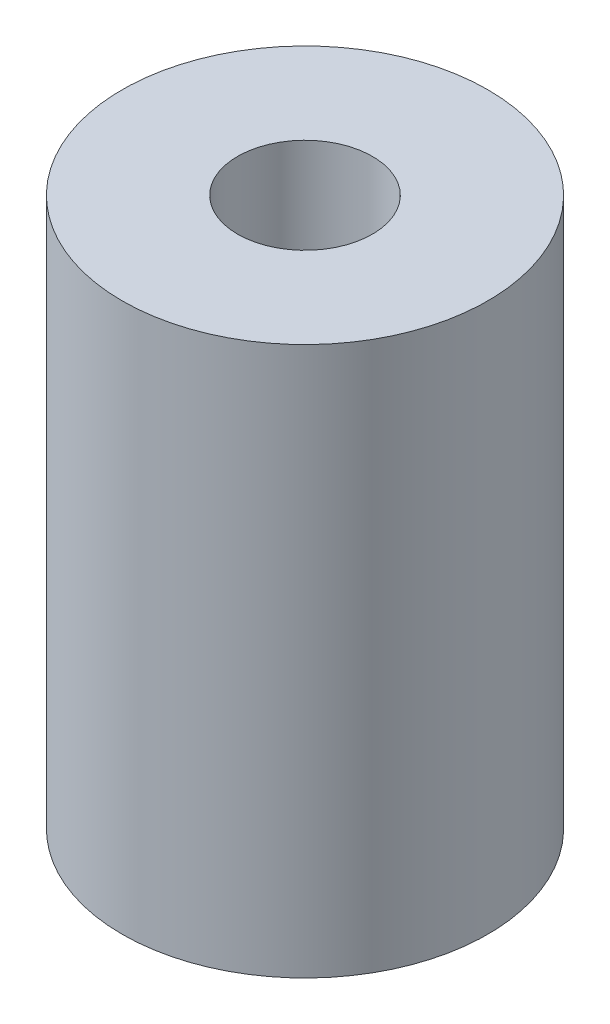
ISO-10303-21;
HEADER;
FILE_DESCRIPTION(('STEP AP214'),'2;1');
FILE_NAME('part.step','',(''),(''),'','','');
FILE_SCHEMA(('AUTOMOTIVE_DESIGN { 1 0 10303 214 1 1 1 1 }'));
ENDSEC;
DATA;
#1=APPLICATION_CONTEXT('core data for automotive mechanical design processes');
#2=APPLICATION_PROTOCOL_DEFINITION('international standard','automotive_design',2000,#1);
#3=PRODUCT_CONTEXT('',#1,'mechanical');
#4=PRODUCT('Part','Part','',(#3));
#5=PRODUCT_RELATED_PRODUCT_CATEGORY('part','',(#4));
#6=PRODUCT_DEFINITION_FORMATION('','',#4);
#7=PRODUCT_DEFINITION_CONTEXT('part definition',#1,'design');
#8=PRODUCT_DEFINITION('design','',#6,#7);
#9=PRODUCT_DEFINITION_SHAPE('','',#8);
#10=(LENGTH_UNIT() NAMED_UNIT(*) SI_UNIT(.MILLI.,.METRE.));
#11=(NAMED_UNIT(*) PLANE_ANGLE_UNIT() SI_UNIT($,.RADIAN.));
#12=(NAMED_UNIT(*) SI_UNIT($,.STERADIAN.) SOLID_ANGLE_UNIT());
#13=UNCERTAINTY_MEASURE_WITH_UNIT(LENGTH_MEASURE(1.E-05),#10,'distance_accuracy_value','');
#14=(GEOMETRIC_REPRESENTATION_CONTEXT(3) GLOBAL_UNCERTAINTY_ASSIGNED_CONTEXT((#13)) GLOBAL_UNIT_ASSIGNED_CONTEXT((#10,
#11,#12)) REPRESENTATION_CONTEXT('',''));
#15=CARTESIAN_POINT('',(0.,0.,0.));
#16=DIRECTION('',(0.,0.,1.));
#17=DIRECTION('',(1.,0.,0.));
#18=AXIS2_PLACEMENT_3D('',#15,#16,#17);
#19=CARTESIAN_POINT('',(0.,12.,0.));
#20=DIRECTION('',(0.,1.,0.));
#21=DIRECTION('',(0.,0.,1.));
#22=AXIS2_PLACEMENT_3D('',#19,#20,#21);
#23=PLANE('',#22);
#24=CARTESIAN_POINT('',(0.,12.,0.));
#25=DIRECTION('',(0.,1.,0.));
#26=DIRECTION('',(0.,0.,1.));
#27=AXIS2_PLACEMENT_3D('',#24,#25,#26);
#28=CIRCLE('',#27,4.);
#29=CARTESIAN_POINT('',(0.,12.,4.));
#30=VERTEX_POINT('',#29);
#31=EDGE_CURVE('E10',#30,#30,#28,.T.);
#32=ORIENTED_EDGE('',*,*,#31,.T.);
#33=EDGE_LOOP('',(#32));
#34=FACE_BOUND('',#33,.T.);
#35=CARTESIAN_POINT('',(0.,12.,0.));
#36=DIRECTION('',(0.,1.,0.));
#37=DIRECTION('',(0.,0.,1.));
#38=AXIS2_PLACEMENT_3D('',#35,#36,#37);
#39=CIRCLE('',#38,1.475);
#40=CARTESIAN_POINT('',(0.,12.,1.475));
#41=VERTEX_POINT('',#40);
#42=EDGE_CURVE('E56',#41,#41,#39,.T.);
#43=ORIENTED_EDGE('',*,*,#42,.F.);
#44=EDGE_LOOP('',(#43));
#45=FACE_BOUND('',#44,.T.);
#46=ADVANCED_FACE('F43',(#34,#45),#23,.T.);
#47=CARTESIAN_POINT('',(0.,0.,0.));
#48=DIRECTION('',(0.,1.,0.));
#49=DIRECTION('',(0.,0.,1.));
#50=AXIS2_PLACEMENT_3D('',#47,#48,#49);
#51=PLANE('',#50);
#52=CARTESIAN_POINT('',(0.,0.,0.));
#53=DIRECTION('',(0.,1.,0.));
#54=DIRECTION('',(0.,0.,1.));
#55=AXIS2_PLACEMENT_3D('',#52,#53,#54);
#56=CIRCLE('',#55,4.);
#57=CARTESIAN_POINT('',(0.,0.,4.));
#58=VERTEX_POINT('',#57);
#59=EDGE_CURVE('E47',#58,#58,#56,.T.);
#60=ORIENTED_EDGE('',*,*,#59,.F.);
#61=EDGE_LOOP('',(#60));
#62=FACE_BOUND('',#61,.T.);
#63=CARTESIAN_POINT('',(0.,0.,0.));
#64=DIRECTION('',(0.,1.,0.));
#65=DIRECTION('',(0.,0.,1.));
#66=AXIS2_PLACEMENT_3D('',#63,#64,#65);
#67=CIRCLE('',#66,1.475);
#68=CARTESIAN_POINT('',(0.,0.,1.475));
#69=VERTEX_POINT('',#68);
#70=EDGE_CURVE('E58',#69,#69,#67,.T.);
#71=ORIENTED_EDGE('',*,*,#70,.T.);
#72=EDGE_LOOP('',(#71));
#73=FACE_BOUND('',#72,.T.);
#74=ADVANCED_FACE('F70',(#62,#73),#51,.F.);
#75=CARTESIAN_POINT('',(0.,12.,0.));
#76=DIRECTION('',(0.,-1.,0.));
#77=DIRECTION('',(0.,0.,-1.));
#78=AXIS2_PLACEMENT_3D('',#75,#76,#77);
#79=CYLINDRICAL_SURFACE('',#78,4.);
#80=ORIENTED_EDGE('',*,*,#31,.F.);
#81=EDGE_LOOP('',(#80));
#82=FACE_BOUND('',#81,.T.);
#83=ORIENTED_EDGE('',*,*,#59,.T.);
#84=EDGE_LOOP('',(#83));
#85=FACE_BOUND('',#84,.T.);
#86=ADVANCED_FACE('F45',(#82,#85),#79,.T.);
#87=CARTESIAN_POINT('',(0.,12.,0.));
#88=DIRECTION('',(0.,-1.,0.));
#89=DIRECTION('',(0.,0.,-1.));
#90=AXIS2_PLACEMENT_3D('',#87,#88,#89);
#91=CYLINDRICAL_SURFACE('',#90,1.475);
#92=ORIENTED_EDGE('',*,*,#42,.T.);
#93=EDGE_LOOP('',(#92));
#94=FACE_BOUND('',#93,.T.);
#95=ORIENTED_EDGE('',*,*,#70,.F.);
#96=EDGE_LOOP('',(#95));
#97=FACE_BOUND('',#96,.T.);
#98=ADVANCED_FACE('F66',(#94,#97),#91,.F.);
#99=CLOSED_SHELL('',(#46,#74,#86,#98));
#100=MANIFOLD_SOLID_BREP('B2',#99);
#101=ADVANCED_BREP_SHAPE_REPRESENTATION('',(#18,#100),#14);
#102=SHAPE_DEFINITION_REPRESENTATION(#9,#101);
ENDSEC;
END-ISO-10303-21;
